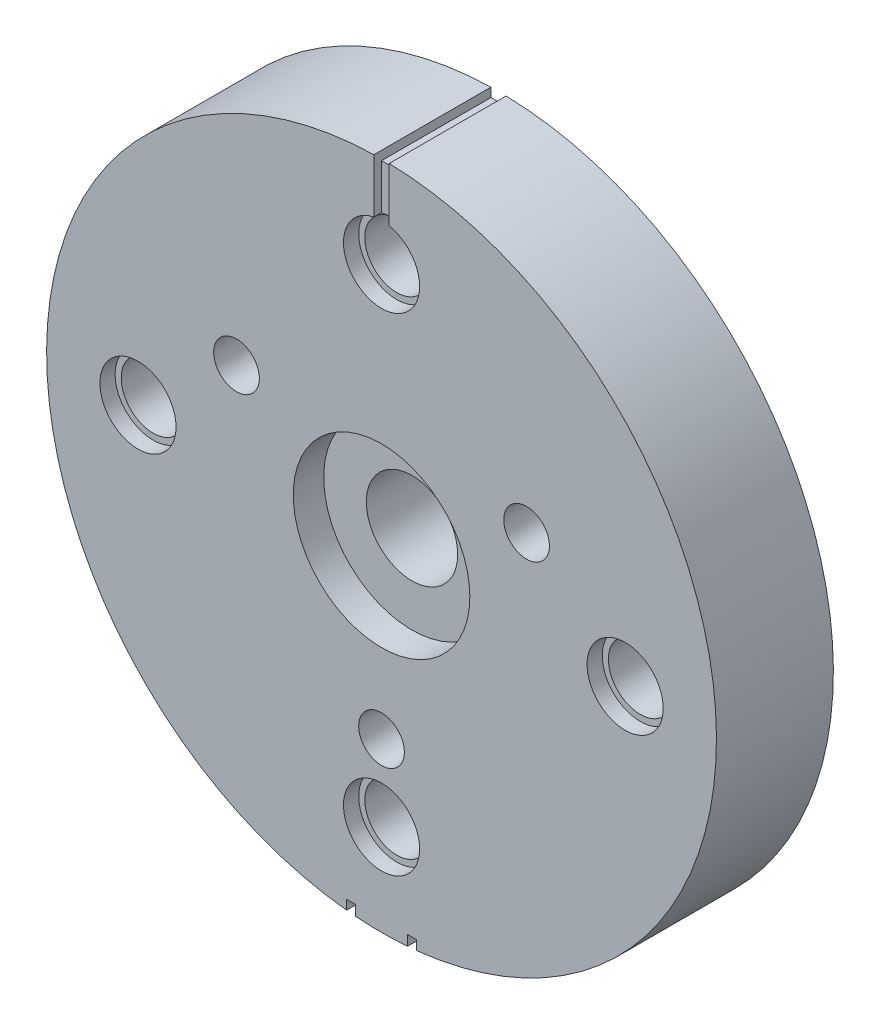
ISO-10303-21;
HEADER;
FILE_DESCRIPTION(('STEP AP214'),'2;1');
FILE_NAME('part.step','',(''),(''),'','','');
FILE_SCHEMA(('AUTOMOTIVE_DESIGN { 1 0 10303 214 1 1 1 1 }'));
ENDSEC;
DATA;
#1=APPLICATION_CONTEXT('core data for automotive mechanical design processes');
#2=APPLICATION_PROTOCOL_DEFINITION('international standard','automotive_design',2000,#1);
#3=PRODUCT_CONTEXT('',#1,'mechanical');
#4=PRODUCT('Part','Part','',(#3));
#5=PRODUCT_RELATED_PRODUCT_CATEGORY('part','',(#4));
#6=PRODUCT_DEFINITION_FORMATION('','',#4);
#7=PRODUCT_DEFINITION_CONTEXT('part definition',#1,'design');
#8=PRODUCT_DEFINITION('design','',#6,#7);
#9=PRODUCT_DEFINITION_SHAPE('','',#8);
#10=(LENGTH_UNIT() NAMED_UNIT(*) SI_UNIT(.MILLI.,.METRE.));
#11=(NAMED_UNIT(*) PLANE_ANGLE_UNIT() SI_UNIT($,.RADIAN.));
#12=(NAMED_UNIT(*) SI_UNIT($,.STERADIAN.) SOLID_ANGLE_UNIT());
#13=UNCERTAINTY_MEASURE_WITH_UNIT(LENGTH_MEASURE(1.E-05),#10,'distance_accuracy_value','');
#14=(GEOMETRIC_REPRESENTATION_CONTEXT(3) GLOBAL_UNCERTAINTY_ASSIGNED_CONTEXT((#13)) GLOBAL_UNIT_ASSIGNED_CONTEXT((#10,
#11,#12)) REPRESENTATION_CONTEXT('',''));
#15=CARTESIAN_POINT('',(0.,0.,0.));
#16=DIRECTION('',(0.,0.,1.));
#17=DIRECTION('',(1.,0.,0.));
#18=AXIS2_PLACEMENT_3D('',#15,#16,#17);
#19=CARTESIAN_POINT('',(-0.25,10.7016404297244,-3.84));
#20=DIRECTION('',(0.,-1.,0.));
#21=DIRECTION('',(0.,0.,-1.));
#22=AXIS2_PLACEMENT_3D('',#19,#20,#21);
#23=PLANE('',#22);
#24=DIRECTION('',(-1.,0.,0.));
#25=VECTOR('',#24,1.);
#26=CARTESIAN_POINT('',(-0.25,10.7016404297244,-0.25));
#27=LINE('',#26,#25);
#28=CARTESIAN_POINT('',(0.25,10.7016404297244,-0.25));
#29=VERTEX_POINT('',#28);
#30=CARTESIAN_POINT('',(-0.25,10.7016404297244,-0.25));
#31=VERTEX_POINT('',#30);
#32=EDGE_CURVE('E142',#29,#31,#27,.T.);
#33=ORIENTED_EDGE('',*,*,#32,.F.);
#34=DIRECTION('',(0.,0.,1.));
#35=VECTOR('',#34,1.);
#36=CARTESIAN_POINT('',(0.25,10.7016404297244,-3.84));
#37=LINE('',#36,#35);
#38=CARTESIAN_POINT('',(0.25,10.7016404297244,-3.84));
#39=VERTEX_POINT('',#38);
#40=EDGE_CURVE('E151',#39,#29,#37,.T.);
#41=ORIENTED_EDGE('',*,*,#40,.F.);
#42=DIRECTION('',(1.,0.,0.));
#43=VECTOR('',#42,1.);
#44=CARTESIAN_POINT('',(-0.25,10.7016404297244,-3.84));
#45=LINE('',#44,#43);
#46=CARTESIAN_POINT('',(-0.25,10.7016404297244,-3.84));
#47=VERTEX_POINT('',#46);
#48=EDGE_CURVE('E149',#47,#39,#45,.T.);
#49=ORIENTED_EDGE('',*,*,#48,.F.);
#50=DIRECTION('',(0.,0.,1.));
#51=VECTOR('',#50,1.);
#52=CARTESIAN_POINT('',(-0.25,10.7016404297244,-3.84));
#53=LINE('',#52,#51);
#54=EDGE_CURVE('E136',#47,#31,#53,.T.);
#55=ORIENTED_EDGE('',*,*,#54,.T.);
#56=EDGE_LOOP('',(#33,#41,#49,#55));
#57=FACE_BOUND('',#56,.T.);
#58=ADVANCED_FACE('F32',(#57),#23,.F.);
#59=CARTESIAN_POINT('',(0.,0.,-3.84));
#60=DIRECTION('',(0.,0.,1.));
#61=DIRECTION('',(1.,0.,0.));
#62=AXIS2_PLACEMENT_3D('',#59,#60,#61);
#63=CYLINDRICAL_SURFACE('',#62,11.);
#64=DIRECTION('',(0.,0.,1.));
#65=VECTOR('',#64,1.);
#66=CARTESIAN_POINT('',(-0.25,10.9971587239614,-3.84));
#67=LINE('',#66,#65);
#68=CARTESIAN_POINT('',(-0.25,10.9971587239614,-3.84));
#69=VERTEX_POINT('',#68);
#70=CARTESIAN_POINT('',(-0.25,10.9971587239614,0.));
#71=VERTEX_POINT('',#70);
#72=EDGE_CURVE('E161',#69,#71,#67,.T.);
#73=ORIENTED_EDGE('',*,*,#72,.F.);
#74=CARTESIAN_POINT('',(0.,0.,-3.84));
#75=DIRECTION('',(0.,0.,1.));
#76=DIRECTION('',(1.,0.,0.));
#77=AXIS2_PLACEMENT_3D('',#74,#75,#76);
#78=CIRCLE('',#77,11.);
#79=CARTESIAN_POINT('',(-1.14687334264794,-10.9400494302322,-3.84));
#80=VERTEX_POINT('',#79);
#81=EDGE_CURVE('E292',#69,#80,#78,.T.);
#82=ORIENTED_EDGE('',*,*,#81,.T.);
#83=DIRECTION('',(0.,0.,1.));
#84=VECTOR('',#83,1.);
#85=CARTESIAN_POINT('',(-1.14687334264794,-10.9400494302322,-3.84));
#86=LINE('',#85,#84);
#87=CARTESIAN_POINT('',(-1.14687334264794,-10.9400494302322,0.));
#88=VERTEX_POINT('',#87);
#89=EDGE_CURVE('E205',#88,#80,#86,.F.);
#90=ORIENTED_EDGE('',*,*,#89,.F.);
#91=CARTESIAN_POINT('',(0.,0.,0.));
#92=DIRECTION('',(0.,0.,1.));
#93=DIRECTION('',(1.,0.,0.));
#94=AXIS2_PLACEMENT_3D('',#91,#92,#93);
#95=CIRCLE('',#94,11.);
#96=EDGE_CURVE('E286',#71,#88,#95,.T.);
#97=ORIENTED_EDGE('',*,*,#96,.F.);
#98=EDGE_LOOP('',(#73,#82,#90,#97));
#99=FACE_BOUND('',#98,.T.);
#100=ADVANCED_FACE('F334',(#99),#63,.T.);
#101=DIRECTION('',(0.,0.,1.));
#102=VECTOR('',#101,1.);
#103=CARTESIAN_POINT('',(0.25,10.9971587239614,-3.84));
#104=LINE('',#103,#102);
#105=CARTESIAN_POINT('',(0.25,10.9971587239614,0.));
#106=VERTEX_POINT('',#105);
#107=CARTESIAN_POINT('',(0.25,10.9971587239614,-3.84));
#108=VERTEX_POINT('',#107);
#109=EDGE_CURVE('E154',#106,#108,#104,.F.);
#110=ORIENTED_EDGE('',*,*,#109,.F.);
#111=CARTESIAN_POINT('',(1.15414337232538,-10.9392848521335,0.));
#112=VERTEX_POINT('',#111);
#113=EDGE_CURVE('E296',#112,#106,#95,.T.);
#114=ORIENTED_EDGE('',*,*,#113,.F.);
#115=DIRECTION('',(0.,0.,1.));
#116=VECTOR('',#115,1.);
#117=CARTESIAN_POINT('',(1.15414337232538,-10.9392848521335,-3.84));
#118=LINE('',#117,#116);
#119=CARTESIAN_POINT('',(1.15414337232538,-10.9392848521335,-3.84));
#120=VERTEX_POINT('',#119);
#121=EDGE_CURVE('E181',#120,#112,#118,.T.);
#122=ORIENTED_EDGE('',*,*,#121,.F.);
#123=EDGE_CURVE('E291',#120,#108,#78,.T.);
#124=ORIENTED_EDGE('',*,*,#123,.T.);
#125=EDGE_LOOP('',(#110,#114,#122,#124));
#126=FACE_BOUND('',#125,.T.);
#127=ADVANCED_FACE('F323',(#126),#63,.T.);
#128=CARTESIAN_POINT('',(0.,0.,-3.84));
#129=DIRECTION('',(0.,0.,1.));
#130=DIRECTION('',(1.,0.,0.));
#131=AXIS2_PLACEMENT_3D('',#128,#129,#130);
#132=CYLINDRICAL_SURFACE('',#131,1.5);
#133=CARTESIAN_POINT('',(0.,0.,-3.84));
#134=DIRECTION('',(0.,0.,1.));
#135=DIRECTION('',(1.,0.,0.));
#136=AXIS2_PLACEMENT_3D('',#133,#134,#135);
#137=CIRCLE('',#136,1.5);
#138=CARTESIAN_POINT('',(1.5,0.,-3.84));
#139=VERTEX_POINT('',#138);
#140=EDGE_CURVE('E281',#139,#139,#137,.T.);
#141=ORIENTED_EDGE('',*,*,#140,.F.);
#142=EDGE_LOOP('',(#141));
#143=FACE_BOUND('',#142,.T.);
#144=CARTESIAN_POINT('',(0.,0.,-1.));
#145=DIRECTION('',(0.,0.,1.));
#146=DIRECTION('',(1.,0.,0.));
#147=AXIS2_PLACEMENT_3D('',#144,#145,#146);
#148=CIRCLE('',#147,1.5);
#149=CARTESIAN_POINT('',(1.5,0.,-1.));
#150=VERTEX_POINT('',#149);
#151=EDGE_CURVE('E272',#150,#150,#148,.T.);
#152=ORIENTED_EDGE('',*,*,#151,.T.);
#153=EDGE_LOOP('',(#152));
#154=FACE_BOUND('',#153,.T.);
#155=ADVANCED_FACE('F442',(#143,#154),#132,.F.);
#156=DIRECTION('',(0.,0.,1.));
#157=VECTOR('',#156,1.);
#158=CARTESIAN_POINT('',(0.853471957951407,-10.9668402749831,-3.84));
#159=LINE('',#158,#157);
#160=CARTESIAN_POINT('',(0.853471957951407,-10.9668402749831,0.));
#161=VERTEX_POINT('',#160);
#162=CARTESIAN_POINT('',(0.853471957951407,-10.9668402749831,-3.84));
#163=VERTEX_POINT('',#162);
#164=EDGE_CURVE('E178',#161,#163,#159,.F.);
#165=ORIENTED_EDGE('',*,*,#164,.F.);
#166=CARTESIAN_POINT('',(-0.847286826870816,-10.9673198655374,0.));
#167=VERTEX_POINT('',#166);
#168=EDGE_CURVE('E293',#167,#161,#95,.T.);
#169=ORIENTED_EDGE('',*,*,#168,.F.);
#170=DIRECTION('',(0.,0.,1.));
#171=VECTOR('',#170,1.);
#172=CARTESIAN_POINT('',(-0.847286826870816,-10.9673198655374,-3.84));
#173=LINE('',#172,#171);
#174=CARTESIAN_POINT('',(-0.847286826870816,-10.9673198655374,-3.84));
#175=VERTEX_POINT('',#174);
#176=EDGE_CURVE('E201',#175,#167,#173,.T.);
#177=ORIENTED_EDGE('',*,*,#176,.F.);
#178=EDGE_CURVE('E287',#175,#163,#78,.T.);
#179=ORIENTED_EDGE('',*,*,#178,.T.);
#180=EDGE_LOOP('',(#165,#169,#177,#179));
#181=FACE_BOUND('',#180,.T.);
#182=ADVANCED_FACE('F34',(#181),#63,.T.);
#183=CARTESIAN_POINT('',(0.,0.,-3.84));
#184=DIRECTION('',(0.,0.,1.));
#185=DIRECTION('',(1.,0.,0.));
#186=AXIS2_PLACEMENT_3D('',#183,#184,#185);
#187=PLANE('',#186);
#188=ORIENTED_EDGE('',*,*,#81,.F.);
#189=DIRECTION('',(0.,-1.,0.));
#190=VECTOR('',#189,1.);
#191=CARTESIAN_POINT('',(-0.25,10.999999392751,-3.84));
#192=LINE('',#191,#190);
#193=EDGE_CURVE('E335',#69,#47,#192,.T.);
#194=ORIENTED_EDGE('',*,*,#193,.T.);
#195=ORIENTED_EDGE('',*,*,#48,.T.);
#196=DIRECTION('',(0.,1.,0.));
#197=VECTOR('',#196,1.);
#198=CARTESIAN_POINT('',(0.25,10.999999392751,-3.84));
#199=LINE('',#198,#197);
#200=EDGE_CURVE('E152',#39,#108,#199,.T.);
#201=ORIENTED_EDGE('',*,*,#200,.T.);
#202=ORIENTED_EDGE('',*,*,#123,.F.);
#203=DIRECTION('',(0.,1.,0.));
#204=VECTOR('',#203,1.);
#205=CARTESIAN_POINT('',(1.15414337232538,-10.6296529722168,-3.84));
#206=LINE('',#205,#204);
#207=CARTESIAN_POINT('',(1.15414337232538,-10.6296529722168,-3.84));
#208=VERTEX_POINT('',#207);
#209=EDGE_CURVE('E164',#120,#208,#206,.T.);
#210=ORIENTED_EDGE('',*,*,#209,.T.);
#211=DIRECTION('',(-1.,0.,0.));
#212=VECTOR('',#211,1.);
#213=CARTESIAN_POINT('',(0.853471957951407,-10.6296529722168,-3.84));
#214=LINE('',#213,#212);
#215=CARTESIAN_POINT('',(0.853471957951407,-10.6296529722168,-3.84));
#216=VERTEX_POINT('',#215);
#217=EDGE_CURVE('E167',#208,#216,#214,.T.);
#218=ORIENTED_EDGE('',*,*,#217,.T.);
#219=DIRECTION('',(0.,-1.,0.));
#220=VECTOR('',#219,1.);
#221=CARTESIAN_POINT('',(0.853471957951407,-10.6296529722168,-3.84));
#222=LINE('',#221,#220);
#223=EDGE_CURVE('E171',#216,#163,#222,.T.);
#224=ORIENTED_EDGE('',*,*,#223,.T.);
#225=ORIENTED_EDGE('',*,*,#178,.F.);
#226=DIRECTION('',(0.,1.,0.));
#227=VECTOR('',#226,1.);
#228=CARTESIAN_POINT('',(-0.847286826870816,-10.6296529722168,-3.84));
#229=LINE('',#228,#227);
#230=CARTESIAN_POINT('',(-0.847286826870816,-10.6296529722168,-3.84));
#231=VERTEX_POINT('',#230);
#232=EDGE_CURVE('E184',#175,#231,#229,.T.);
#233=ORIENTED_EDGE('',*,*,#232,.T.);
#234=DIRECTION('',(-1.,0.,0.));
#235=VECTOR('',#234,1.);
#236=CARTESIAN_POINT('',(-1.14687334264794,-10.6296529722168,-3.84));
#237=LINE('',#236,#235);
#238=CARTESIAN_POINT('',(-1.14687334264794,-10.6296529722168,-3.84));
#239=VERTEX_POINT('',#238);
#240=EDGE_CURVE('E187',#231,#239,#237,.T.);
#241=ORIENTED_EDGE('',*,*,#240,.T.);
#242=DIRECTION('',(0.,-1.,0.));
#243=VECTOR('',#242,1.);
#244=CARTESIAN_POINT('',(-1.14687334264794,-10.6296529722168,-3.84));
#245=LINE('',#244,#243);
#246=EDGE_CURVE('E191',#239,#80,#245,.T.);
#247=ORIENTED_EDGE('',*,*,#246,.T.);
#248=EDGE_LOOP('',(#188,#194,#195,#201,#202,#210,#218,#224,#225,#233,#241,#247));
#249=FACE_BOUND('',#248,.T.);
#250=ORIENTED_EDGE('',*,*,#140,.T.);
#251=EDGE_LOOP('',(#250));
#252=FACE_BOUND('',#251,.T.);
#253=ADVANCED_FACE('F317',(#249,#252),#187,.F.);
#254=CARTESIAN_POINT('',(0.,0.,0.));
#255=DIRECTION('',(0.,0.,1.));
#256=DIRECTION('',(1.,0.,0.));
#257=AXIS2_PLACEMENT_3D('',#254,#255,#256);
#258=PLANE('',#257);
#259=CARTESIAN_POINT('',(0.,8.,0.));
#260=DIRECTION('',(0.,0.,1.));
#261=DIRECTION('',(1.,0.,0.));
#262=AXIS2_PLACEMENT_3D('',#259,#260,#261);
#263=CIRCLE('',#262,1.25);
#264=CARTESIAN_POINT('',(-0.25,9.22474487139159,0.));
#265=VERTEX_POINT('',#264);
#266=CARTESIAN_POINT('',(0.25,9.22474487139159,0.));
#267=VERTEX_POINT('',#266);
#268=EDGE_CURVE('E211',#265,#267,#263,.T.);
#269=ORIENTED_EDGE('',*,*,#268,.F.);
#270=DIRECTION('',(0.,-1.,0.));
#271=VECTOR('',#270,1.);
#272=CARTESIAN_POINT('',(-0.25,0.,0.));
#273=LINE('',#272,#271);
#274=EDGE_CURVE('E11',#71,#265,#273,.T.);
#275=ORIENTED_EDGE('',*,*,#274,.F.);
#276=ORIENTED_EDGE('',*,*,#96,.T.);
#277=DIRECTION('',(0.,-1.,0.));
#278=VECTOR('',#277,1.);
#279=CARTESIAN_POINT('',(-1.14687334264794,-10.6296529722168,0.));
#280=LINE('',#279,#278);
#281=CARTESIAN_POINT('',(-1.14687334264794,-10.6296529722168,0.));
#282=VERTEX_POINT('',#281);
#283=EDGE_CURVE('E188',#282,#88,#280,.T.);
#284=ORIENTED_EDGE('',*,*,#283,.F.);
#285=DIRECTION('',(-1.,0.,0.));
#286=VECTOR('',#285,1.);
#287=CARTESIAN_POINT('',(-1.14687334264794,-10.6296529722168,0.));
#288=LINE('',#287,#286);
#289=CARTESIAN_POINT('',(-0.847286826870816,-10.6296529722168,0.));
#290=VERTEX_POINT('',#289);
#291=EDGE_CURVE('E183',#290,#282,#288,.T.);
#292=ORIENTED_EDGE('',*,*,#291,.F.);
#293=DIRECTION('',(0.,1.,0.));
#294=VECTOR('',#293,1.);
#295=CARTESIAN_POINT('',(-0.847286826870816,0.,0.));
#296=LINE('',#295,#294);
#297=EDGE_CURVE('E290',#167,#290,#296,.T.);
#298=ORIENTED_EDGE('',*,*,#297,.F.);
#299=ORIENTED_EDGE('',*,*,#168,.T.);
#300=DIRECTION('',(0.,-1.,0.));
#301=VECTOR('',#300,1.);
#302=CARTESIAN_POINT('',(0.853471957951407,-10.6296529722168,0.));
#303=LINE('',#302,#301);
#304=CARTESIAN_POINT('',(0.853471957951407,-10.6296529722168,0.));
#305=VERTEX_POINT('',#304);
#306=EDGE_CURVE('E168',#305,#161,#303,.T.);
#307=ORIENTED_EDGE('',*,*,#306,.F.);
#308=DIRECTION('',(-1.,0.,0.));
#309=VECTOR('',#308,1.);
#310=CARTESIAN_POINT('',(0.853471957951407,-10.6296529722168,0.));
#311=LINE('',#310,#309);
#312=CARTESIAN_POINT('',(1.15414337232538,-10.6296529722168,0.));
#313=VERTEX_POINT('',#312);
#314=EDGE_CURVE('E163',#313,#305,#311,.T.);
#315=ORIENTED_EDGE('',*,*,#314,.F.);
#316=DIRECTION('',(0.,1.,0.));
#317=VECTOR('',#316,1.);
#318=CARTESIAN_POINT('',(1.15414337232538,0.,0.));
#319=LINE('',#318,#317);
#320=EDGE_CURVE('E40',#112,#313,#319,.T.);
#321=ORIENTED_EDGE('',*,*,#320,.F.);
#322=ORIENTED_EDGE('',*,*,#113,.T.);
#323=DIRECTION('',(0.,1.,0.));
#324=VECTOR('',#323,1.);
#325=CARTESIAN_POINT('',(0.25,10.999999392751,0.));
#326=LINE('',#325,#324);
#327=EDGE_CURVE('E722',#267,#106,#326,.T.);
#328=ORIENTED_EDGE('',*,*,#327,.F.);
#329=EDGE_LOOP('',(#269,#275,#276,#284,#292,#298,#299,#307,#315,#321,#322,#328));
#330=FACE_BOUND('',#329,.T.);
#331=CARTESIAN_POINT('',(8.,0.,0.));
#332=DIRECTION('',(0.,0.,1.));
#333=DIRECTION('',(1.,0.,0.));
#334=AXIS2_PLACEMENT_3D('',#331,#332,#333);
#335=CIRCLE('',#334,1.25);
#336=CARTESIAN_POINT('',(9.25,0.,0.));
#337=VERTEX_POINT('',#336);
#338=EDGE_CURVE('E220',#337,#337,#335,.T.);
#339=ORIENTED_EDGE('',*,*,#338,.F.);
#340=EDGE_LOOP('',(#339));
#341=FACE_BOUND('',#340,.T.);
#342=CARTESIAN_POINT('',(0.,-8.,0.));
#343=DIRECTION('',(0.,0.,1.));
#344=DIRECTION('',(1.,0.,0.));
#345=AXIS2_PLACEMENT_3D('',#342,#343,#344);
#346=CIRCLE('',#345,1.25);
#347=CARTESIAN_POINT('',(1.25,-8.,0.));
#348=VERTEX_POINT('',#347);
#349=EDGE_CURVE('E229',#348,#348,#346,.T.);
#350=ORIENTED_EDGE('',*,*,#349,.F.);
#351=EDGE_LOOP('',(#350));
#352=FACE_BOUND('',#351,.T.);
#353=CARTESIAN_POINT('',(-8.,0.,0.));
#354=DIRECTION('',(0.,0.,1.));
#355=DIRECTION('',(1.,0.,0.));
#356=AXIS2_PLACEMENT_3D('',#353,#354,#355);
#357=CIRCLE('',#356,1.25);
#358=CARTESIAN_POINT('',(-6.75,0.,0.));
#359=VERTEX_POINT('',#358);
#360=EDGE_CURVE('E238',#359,#359,#357,.T.);
#361=ORIENTED_EDGE('',*,*,#360,.F.);
#362=EDGE_LOOP('',(#361));
#363=FACE_BOUND('',#362,.T.);
#364=CARTESIAN_POINT('',(0.,-5.5,0.));
#365=DIRECTION('',(0.,0.,1.));
#366=DIRECTION('',(1.,0.,0.));
#367=AXIS2_PLACEMENT_3D('',#364,#365,#366);
#368=CIRCLE('',#367,0.75);
#369=CARTESIAN_POINT('',(0.75,-5.5,0.));
#370=VERTEX_POINT('',#369);
#371=EDGE_CURVE('E256',#370,#370,#368,.T.);
#372=ORIENTED_EDGE('',*,*,#371,.F.);
#373=EDGE_LOOP('',(#372));
#374=FACE_BOUND('',#373,.T.);
#375=CARTESIAN_POINT('',(4.763139720814,2.75,0.));
#376=DIRECTION('',(0.,0.,1.));
#377=DIRECTION('',(1.,0.,0.));
#378=AXIS2_PLACEMENT_3D('',#375,#376,#377);
#379=CIRCLE('',#378,0.75);
#380=CARTESIAN_POINT('',(5.513139720814,2.75,0.));
#381=VERTEX_POINT('',#380);
#382=EDGE_CURVE('E260',#381,#381,#379,.T.);
#383=ORIENTED_EDGE('',*,*,#382,.F.);
#384=EDGE_LOOP('',(#383));
#385=FACE_BOUND('',#384,.T.);
#386=CARTESIAN_POINT('',(-4.763139720814,2.75,0.));
#387=DIRECTION('',(0.,0.,1.));
#388=DIRECTION('',(1.,0.,0.));
#389=AXIS2_PLACEMENT_3D('',#386,#387,#388);
#390=CIRCLE('',#389,0.75);
#391=CARTESIAN_POINT('',(-4.013139720814,2.75,0.));
#392=VERTEX_POINT('',#391);
#393=EDGE_CURVE('E266',#392,#392,#390,.T.);
#394=ORIENTED_EDGE('',*,*,#393,.F.);
#395=EDGE_LOOP('',(#394));
#396=FACE_BOUND('',#395,.T.);
#397=CARTESIAN_POINT('',(0.,0.,0.));
#398=DIRECTION('',(0.,0.,1.));
#399=DIRECTION('',(1.,0.,0.));
#400=AXIS2_PLACEMENT_3D('',#397,#398,#399);
#401=CIRCLE('',#400,2.9);
#402=CARTESIAN_POINT('',(2.9,0.,0.));
#403=VERTEX_POINT('',#402);
#404=EDGE_CURVE('E277',#403,#403,#401,.T.);
#405=ORIENTED_EDGE('',*,*,#404,.F.);
#406=EDGE_LOOP('',(#405));
#407=FACE_BOUND('',#406,.T.);
#408=ADVANCED_FACE('F307',(#330,#341,#352,#363,#374,#385,#396,#407),#258,.T.);
#409=CARTESIAN_POINT('',(0.,0.,-1.));
#410=DIRECTION('',(0.,0.,1.));
#411=DIRECTION('',(1.,0.,0.));
#412=AXIS2_PLACEMENT_3D('',#409,#410,#411);
#413=CYLINDRICAL_SURFACE('',#412,2.9);
#414=CARTESIAN_POINT('',(0.,0.,-1.));
#415=DIRECTION('',(0.,0.,1.));
#416=DIRECTION('',(1.,0.,0.));
#417=AXIS2_PLACEMENT_3D('',#414,#415,#416);
#418=CIRCLE('',#417,2.9);
#419=CARTESIAN_POINT('',(2.9,0.,-1.));
#420=VERTEX_POINT('',#419);
#421=EDGE_CURVE('E278',#420,#420,#418,.T.);
#422=ORIENTED_EDGE('',*,*,#421,.F.);
#423=EDGE_LOOP('',(#422));
#424=FACE_BOUND('',#423,.T.);
#425=ORIENTED_EDGE('',*,*,#404,.T.);
#426=EDGE_LOOP('',(#425));
#427=FACE_BOUND('',#426,.T.);
#428=ADVANCED_FACE('F437',(#424,#427),#413,.F.);
#429=CARTESIAN_POINT('',(0.,0.,-1.));
#430=DIRECTION('',(0.,0.,1.));
#431=DIRECTION('',(1.,0.,0.));
#432=AXIS2_PLACEMENT_3D('',#429,#430,#431);
#433=PLANE('',#432);
#434=ORIENTED_EDGE('',*,*,#151,.F.);
#435=EDGE_LOOP('',(#434));
#436=FACE_BOUND('',#435,.T.);
#437=ORIENTED_EDGE('',*,*,#421,.T.);
#438=EDGE_LOOP('',(#437));
#439=FACE_BOUND('',#438,.T.);
#440=ADVANCED_FACE('F433',(#436,#439),#433,.T.);
#441=CARTESIAN_POINT('',(-4.763139720814,2.75,-2.));
#442=DIRECTION('',(0.,0.,1.));
#443=DIRECTION('',(1.,0.,0.));
#444=AXIS2_PLACEMENT_3D('',#441,#442,#443);
#445=CYLINDRICAL_SURFACE('',#444,0.75);
#446=CARTESIAN_POINT('',(-4.763139720814,2.75,-2.));
#447=DIRECTION('',(0.,0.,1.));
#448=DIRECTION('',(1.,0.,0.));
#449=AXIS2_PLACEMENT_3D('',#446,#447,#448);
#450=CIRCLE('',#449,0.75);
#451=CARTESIAN_POINT('',(-4.013139720814,2.75,-2.));
#452=VERTEX_POINT('',#451);
#453=EDGE_CURVE('E269',#452,#452,#450,.T.);
#454=ORIENTED_EDGE('',*,*,#453,.F.);
#455=EDGE_LOOP('',(#454));
#456=FACE_BOUND('',#455,.T.);
#457=ORIENTED_EDGE('',*,*,#393,.T.);
#458=EDGE_LOOP('',(#457));
#459=FACE_BOUND('',#458,.T.);
#460=ADVANCED_FACE('F429',(#456,#459),#445,.F.);
#461=CARTESIAN_POINT('',(-4.763139720814,2.75,-2.));
#462=DIRECTION('',(0.,0.,1.));
#463=DIRECTION('',(1.,0.,0.));
#464=AXIS2_PLACEMENT_3D('',#461,#462,#463);
#465=PLANE('',#464);
#466=ORIENTED_EDGE('',*,*,#453,.T.);
#467=EDGE_LOOP('',(#466));
#468=FACE_BOUND('',#467,.T.);
#469=ADVANCED_FACE('F425',(#468),#465,.T.);
#470=CARTESIAN_POINT('',(4.763139720814,2.75,-2.));
#471=DIRECTION('',(0.,0.,1.));
#472=DIRECTION('',(1.,0.,0.));
#473=AXIS2_PLACEMENT_3D('',#470,#471,#472);
#474=CYLINDRICAL_SURFACE('',#473,0.75);
#475=CARTESIAN_POINT('',(4.763139720814,2.75,-2.));
#476=DIRECTION('',(0.,0.,1.));
#477=DIRECTION('',(1.,0.,0.));
#478=AXIS2_PLACEMENT_3D('',#475,#476,#477);
#479=CIRCLE('',#478,0.75);
#480=CARTESIAN_POINT('',(5.513139720814,2.75,-2.));
#481=VERTEX_POINT('',#480);
#482=EDGE_CURVE('E263',#481,#481,#479,.T.);
#483=ORIENTED_EDGE('',*,*,#482,.F.);
#484=EDGE_LOOP('',(#483));
#485=FACE_BOUND('',#484,.T.);
#486=ORIENTED_EDGE('',*,*,#382,.T.);
#487=EDGE_LOOP('',(#486));
#488=FACE_BOUND('',#487,.T.);
#489=ADVANCED_FACE('F421',(#485,#488),#474,.F.);
#490=CARTESIAN_POINT('',(4.763139720814,2.75,-2.));
#491=DIRECTION('',(0.,0.,1.));
#492=DIRECTION('',(1.,0.,0.));
#493=AXIS2_PLACEMENT_3D('',#490,#491,#492);
#494=PLANE('',#493);
#495=ORIENTED_EDGE('',*,*,#482,.T.);
#496=EDGE_LOOP('',(#495));
#497=FACE_BOUND('',#496,.T.);
#498=ADVANCED_FACE('F417',(#497),#494,.T.);
#499=CARTESIAN_POINT('',(0.,-5.5,-2.));
#500=DIRECTION('',(0.,0.,1.));
#501=DIRECTION('',(1.,0.,0.));
#502=AXIS2_PLACEMENT_3D('',#499,#500,#501);
#503=CYLINDRICAL_SURFACE('',#502,0.75);
#504=CARTESIAN_POINT('',(0.,-5.5,-2.));
#505=DIRECTION('',(0.,0.,1.));
#506=DIRECTION('',(1.,0.,0.));
#507=AXIS2_PLACEMENT_3D('',#504,#505,#506);
#508=CIRCLE('',#507,0.75);
#509=CARTESIAN_POINT('',(0.75,-5.5,-2.));
#510=VERTEX_POINT('',#509);
#511=EDGE_CURVE('E257',#510,#510,#508,.T.);
#512=ORIENTED_EDGE('',*,*,#511,.F.);
#513=EDGE_LOOP('',(#512));
#514=FACE_BOUND('',#513,.T.);
#515=ORIENTED_EDGE('',*,*,#371,.T.);
#516=EDGE_LOOP('',(#515));
#517=FACE_BOUND('',#516,.T.);
#518=ADVANCED_FACE('F413',(#514,#517),#503,.F.);
#519=CARTESIAN_POINT('',(0.,-5.5,-2.));
#520=DIRECTION('',(0.,0.,1.));
#521=DIRECTION('',(1.,0.,0.));
#522=AXIS2_PLACEMENT_3D('',#519,#520,#521);
#523=PLANE('',#522);
#524=ORIENTED_EDGE('',*,*,#511,.T.);
#525=EDGE_LOOP('',(#524));
#526=FACE_BOUND('',#525,.T.);
#527=ADVANCED_FACE('F409',(#526),#523,.T.);
#528=CARTESIAN_POINT('',(-8.,0.,-0.5));
#529=DIRECTION('',(0.,0.,1.));
#530=DIRECTION('',(1.,0.,0.));
#531=AXIS2_PLACEMENT_3D('',#528,#529,#530);
#532=CYLINDRICAL_SURFACE('',#531,1.25);
#533=CARTESIAN_POINT('',(-8.,0.,-0.5));
#534=DIRECTION('',(0.,0.,1.));
#535=DIRECTION('',(1.,0.,0.));
#536=AXIS2_PLACEMENT_3D('',#533,#534,#535);
#537=CIRCLE('',#536,1.25);
#538=CARTESIAN_POINT('',(-6.75,0.,-0.5));
#539=VERTEX_POINT('',#538);
#540=EDGE_CURVE('E239',#539,#539,#537,.T.);
#541=ORIENTED_EDGE('',*,*,#540,.F.);
#542=EDGE_LOOP('',(#541));
#543=FACE_BOUND('',#542,.T.);
#544=ORIENTED_EDGE('',*,*,#360,.T.);
#545=EDGE_LOOP('',(#544));
#546=FACE_BOUND('',#545,.T.);
#547=ADVANCED_FACE('F412',(#543,#546),#532,.F.);
#548=CARTESIAN_POINT('',(-8.,0.,-0.5));
#549=DIRECTION('',(0.,0.,1.));
#550=DIRECTION('',(1.,0.,0.));
#551=AXIS2_PLACEMENT_3D('',#548,#549,#550);
#552=PLANE('',#551);
#553=CARTESIAN_POINT('',(-8.,0.,-0.5));
#554=DIRECTION('',(0.,0.,1.));
#555=DIRECTION('',(1.,0.,0.));
#556=AXIS2_PLACEMENT_3D('',#553,#554,#555);
#557=CIRCLE('',#556,1.05);
#558=CARTESIAN_POINT('',(-6.95,0.,-0.5));
#559=VERTEX_POINT('',#558);
#560=EDGE_CURVE('E233',#559,#559,#557,.T.);
#561=ORIENTED_EDGE('',*,*,#560,.F.);
#562=EDGE_LOOP('',(#561));
#563=FACE_BOUND('',#562,.T.);
#564=ORIENTED_EDGE('',*,*,#540,.T.);
#565=EDGE_LOOP('',(#564));
#566=FACE_BOUND('',#565,.T.);
#567=ADVANCED_FACE('F494',(#563,#566),#552,.T.);
#568=CARTESIAN_POINT('',(-8.,0.,-3.));
#569=DIRECTION('',(0.,0.,1.));
#570=DIRECTION('',(1.,0.,0.));
#571=AXIS2_PLACEMENT_3D('',#568,#569,#570);
#572=PLANE('',#571);
#573=CARTESIAN_POINT('',(-8.,0.,-3.));
#574=DIRECTION('',(0.,0.,1.));
#575=DIRECTION('',(1.,0.,0.));
#576=AXIS2_PLACEMENT_3D('',#573,#574,#575);
#577=CIRCLE('',#576,1.05);
#578=CARTESIAN_POINT('',(-6.95,0.,-3.));
#579=VERTEX_POINT('',#578);
#580=EDGE_CURVE('E242',#579,#579,#577,.T.);
#581=ORIENTED_EDGE('',*,*,#580,.T.);
#582=EDGE_LOOP('',(#581));
#583=FACE_BOUND('',#582,.T.);
#584=ADVANCED_FACE('F386',(#583),#572,.T.);
#585=CARTESIAN_POINT('',(-8.,0.,-3.));
#586=DIRECTION('',(0.,0.,1.));
#587=DIRECTION('',(1.,0.,0.));
#588=AXIS2_PLACEMENT_3D('',#585,#586,#587);
#589=CYLINDRICAL_SURFACE('',#588,1.05);
#590=ORIENTED_EDGE('',*,*,#580,.F.);
#591=EDGE_LOOP('',(#590));
#592=FACE_BOUND('',#591,.T.);
#593=ORIENTED_EDGE('',*,*,#560,.T.);
#594=EDGE_LOOP('',(#593));
#595=FACE_BOUND('',#594,.T.);
#596=ADVANCED_FACE('F510',(#592,#595),#589,.F.);
#597=CARTESIAN_POINT('',(0.,-8.,-0.5));
#598=DIRECTION('',(0.,0.,1.));
#599=DIRECTION('',(1.,0.,0.));
#600=AXIS2_PLACEMENT_3D('',#597,#598,#599);
#601=CYLINDRICAL_SURFACE('',#600,1.25);
#602=CARTESIAN_POINT('',(0.,-8.,-0.5));
#603=DIRECTION('',(0.,0.,1.));
#604=DIRECTION('',(1.,0.,0.));
#605=AXIS2_PLACEMENT_3D('',#602,#603,#604);
#606=CIRCLE('',#605,1.25);
#607=CARTESIAN_POINT('',(1.25,-8.,-0.5));
#608=VERTEX_POINT('',#607);
#609=EDGE_CURVE('E230',#608,#608,#606,.T.);
#610=ORIENTED_EDGE('',*,*,#609,.F.);
#611=EDGE_LOOP('',(#610));
#612=FACE_BOUND('',#611,.T.);
#613=ORIENTED_EDGE('',*,*,#349,.T.);
#614=EDGE_LOOP('',(#613));
#615=FACE_BOUND('',#614,.T.);
#616=ADVANCED_FACE('F517',(#612,#615),#601,.F.);
#617=CARTESIAN_POINT('',(0.,-8.,-0.5));
#618=DIRECTION('',(0.,0.,1.));
#619=DIRECTION('',(1.,0.,0.));
#620=AXIS2_PLACEMENT_3D('',#617,#618,#619);
#621=PLANE('',#620);
#622=CARTESIAN_POINT('',(0.,-8.,-0.5));
#623=DIRECTION('',(0.,0.,1.));
#624=DIRECTION('',(1.,0.,0.));
#625=AXIS2_PLACEMENT_3D('',#622,#623,#624);
#626=CIRCLE('',#625,1.05);
#627=CARTESIAN_POINT('',(1.05,-8.,-0.5));
#628=VERTEX_POINT('',#627);
#629=EDGE_CURVE('E224',#628,#628,#626,.T.);
#630=ORIENTED_EDGE('',*,*,#629,.F.);
#631=EDGE_LOOP('',(#630));
#632=FACE_BOUND('',#631,.T.);
#633=ORIENTED_EDGE('',*,*,#609,.T.);
#634=EDGE_LOOP('',(#633));
#635=FACE_BOUND('',#634,.T.);
#636=ADVANCED_FACE('F403',(#632,#635),#621,.T.);
#637=CARTESIAN_POINT('',(0.,-8.,-3.));
#638=DIRECTION('',(0.,0.,1.));
#639=DIRECTION('',(1.,0.,0.));
#640=AXIS2_PLACEMENT_3D('',#637,#638,#639);
#641=PLANE('',#640);
#642=CARTESIAN_POINT('',(0.,-8.,-3.));
#643=DIRECTION('',(0.,0.,1.));
#644=DIRECTION('',(1.,0.,0.));
#645=AXIS2_PLACEMENT_3D('',#642,#643,#644);
#646=CIRCLE('',#645,1.05);
#647=CARTESIAN_POINT('',(1.05,-8.,-3.));
#648=VERTEX_POINT('',#647);
#649=EDGE_CURVE('E253',#648,#648,#646,.T.);
#650=ORIENTED_EDGE('',*,*,#649,.T.);
#651=EDGE_LOOP('',(#650));
#652=FACE_BOUND('',#651,.T.);
#653=ADVANCED_FACE('F399',(#652),#641,.T.);
#654=CARTESIAN_POINT('',(0.,-8.,-3.));
#655=DIRECTION('',(0.,0.,1.));
#656=DIRECTION('',(1.,0.,0.));
#657=AXIS2_PLACEMENT_3D('',#654,#655,#656);
#658=CYLINDRICAL_SURFACE('',#657,1.05);
#659=ORIENTED_EDGE('',*,*,#649,.F.);
#660=EDGE_LOOP('',(#659));
#661=FACE_BOUND('',#660,.T.);
#662=ORIENTED_EDGE('',*,*,#629,.T.);
#663=EDGE_LOOP('',(#662));
#664=FACE_BOUND('',#663,.T.);
#665=ADVANCED_FACE('F402',(#661,#664),#658,.F.);
#666=CARTESIAN_POINT('',(8.,0.,-0.5));
#667=DIRECTION('',(0.,0.,1.));
#668=DIRECTION('',(1.,0.,0.));
#669=AXIS2_PLACEMENT_3D('',#666,#667,#668);
#670=CYLINDRICAL_SURFACE('',#669,1.25);
#671=CARTESIAN_POINT('',(8.,0.,-0.5));
#672=DIRECTION('',(0.,0.,1.));
#673=DIRECTION('',(1.,0.,0.));
#674=AXIS2_PLACEMENT_3D('',#671,#672,#673);
#675=CIRCLE('',#674,1.25);
#676=CARTESIAN_POINT('',(9.25,0.,-0.5));
#677=VERTEX_POINT('',#676);
#678=EDGE_CURVE('E221',#677,#677,#675,.T.);
#679=ORIENTED_EDGE('',*,*,#678,.F.);
#680=EDGE_LOOP('',(#679));
#681=FACE_BOUND('',#680,.T.);
#682=ORIENTED_EDGE('',*,*,#338,.T.);
#683=EDGE_LOOP('',(#682));
#684=FACE_BOUND('',#683,.T.);
#685=ADVANCED_FACE('F407',(#681,#684),#670,.F.);
#686=CARTESIAN_POINT('',(8.,0.,-0.5));
#687=DIRECTION('',(0.,0.,1.));
#688=DIRECTION('',(1.,0.,0.));
#689=AXIS2_PLACEMENT_3D('',#686,#687,#688);
#690=PLANE('',#689);
#691=CARTESIAN_POINT('',(8.,0.,-0.5));
#692=DIRECTION('',(0.,0.,1.));
#693=DIRECTION('',(1.,0.,0.));
#694=AXIS2_PLACEMENT_3D('',#691,#692,#693);
#695=CIRCLE('',#694,1.05);
#696=CARTESIAN_POINT('',(9.05,0.,-0.5));
#697=VERTEX_POINT('',#696);
#698=EDGE_CURVE('E215',#697,#697,#695,.T.);
#699=ORIENTED_EDGE('',*,*,#698,.F.);
#700=EDGE_LOOP('',(#699));
#701=FACE_BOUND('',#700,.T.);
#702=ORIENTED_EDGE('',*,*,#678,.T.);
#703=EDGE_LOOP('',(#702));
#704=FACE_BOUND('',#703,.T.);
#705=ADVANCED_FACE('F397',(#701,#704),#690,.T.);
#706=CARTESIAN_POINT('',(8.,0.,-3.));
#707=DIRECTION('',(0.,0.,1.));
#708=DIRECTION('',(1.,0.,0.));
#709=AXIS2_PLACEMENT_3D('',#706,#707,#708);
#710=PLANE('',#709);
#711=CARTESIAN_POINT('',(8.,0.,-3.));
#712=DIRECTION('',(0.,0.,1.));
#713=DIRECTION('',(1.,0.,0.));
#714=AXIS2_PLACEMENT_3D('',#711,#712,#713);
#715=CIRCLE('',#714,1.05);
#716=CARTESIAN_POINT('',(9.05,0.,-3.));
#717=VERTEX_POINT('',#716);
#718=EDGE_CURVE('E250',#717,#717,#715,.T.);
#719=ORIENTED_EDGE('',*,*,#718,.T.);
#720=EDGE_LOOP('',(#719));
#721=FACE_BOUND('',#720,.T.);
#722=ADVANCED_FACE('F393',(#721),#710,.T.);
#723=CARTESIAN_POINT('',(8.,0.,-3.));
#724=DIRECTION('',(0.,0.,1.));
#725=DIRECTION('',(1.,0.,0.));
#726=AXIS2_PLACEMENT_3D('',#723,#724,#725);
#727=CYLINDRICAL_SURFACE('',#726,1.05);
#728=ORIENTED_EDGE('',*,*,#718,.F.);
#729=EDGE_LOOP('',(#728));
#730=FACE_BOUND('',#729,.T.);
#731=ORIENTED_EDGE('',*,*,#698,.T.);
#732=EDGE_LOOP('',(#731));
#733=FACE_BOUND('',#732,.T.);
#734=ADVANCED_FACE('F389',(#730,#733),#727,.F.);
#735=CARTESIAN_POINT('',(0.,8.,-0.5));
#736=DIRECTION('',(0.,0.,1.));
#737=DIRECTION('',(1.,0.,0.));
#738=AXIS2_PLACEMENT_3D('',#735,#736,#737);
#739=CYLINDRICAL_SURFACE('',#738,1.25);
#740=CARTESIAN_POINT('',(0.,8.,-0.5));
#741=DIRECTION('',(0.,0.,1.));
#742=DIRECTION('',(1.,0.,0.));
#743=AXIS2_PLACEMENT_3D('',#740,#741,#742);
#744=CIRCLE('',#743,1.25);
#745=CARTESIAN_POINT('',(1.25,8.,-0.5));
#746=VERTEX_POINT('',#745);
#747=EDGE_CURVE('E212',#746,#746,#744,.T.);
#748=ORIENTED_EDGE('',*,*,#747,.F.);
#749=EDGE_LOOP('',(#748));
#750=FACE_BOUND('',#749,.T.);
#751=CARTESIAN_POINT('',(0.,8.,-0.25));
#752=DIRECTION('',(0.,0.,1.));
#753=DIRECTION('',(1.,0.,0.));
#754=AXIS2_PLACEMENT_3D('',#751,#752,#753);
#755=CIRCLE('',#754,1.25);
#756=CARTESIAN_POINT('',(-0.25,9.22474487139159,-0.25));
#757=VERTEX_POINT('',#756);
#758=CARTESIAN_POINT('',(0.25,9.22474487139159,-0.25));
#759=VERTEX_POINT('',#758);
#760=EDGE_CURVE('E146',#757,#759,#755,.F.);
#761=ORIENTED_EDGE('',*,*,#760,.F.);
#762=DIRECTION('',(0.,0.,1.));
#763=VECTOR('',#762,1.);
#764=CARTESIAN_POINT('',(-0.25,9.22474487139159,-0.5));
#765=LINE('',#764,#763);
#766=EDGE_CURVE('E139',#757,#265,#765,.T.);
#767=ORIENTED_EDGE('',*,*,#766,.T.);
#768=ORIENTED_EDGE('',*,*,#268,.T.);
#769=DIRECTION('',(0.,0.,1.));
#770=VECTOR('',#769,1.);
#771=CARTESIAN_POINT('',(0.25,9.22474487139159,-0.5));
#772=LINE('',#771,#770);
#773=EDGE_CURVE('E726',#267,#759,#772,.F.);
#774=ORIENTED_EDGE('',*,*,#773,.T.);
#775=EDGE_LOOP('',(#761,#767,#768,#774));
#776=FACE_BOUND('',#775,.T.);
#777=ADVANCED_FACE('F392',(#750,#776),#739,.F.);
#778=CARTESIAN_POINT('',(0.,8.,-0.5));
#779=DIRECTION('',(0.,0.,1.));
#780=DIRECTION('',(1.,0.,0.));
#781=AXIS2_PLACEMENT_3D('',#778,#779,#780);
#782=PLANE('',#781);
#783=CARTESIAN_POINT('',(0.,8.,-0.5));
#784=DIRECTION('',(0.,0.,1.));
#785=DIRECTION('',(1.,0.,0.));
#786=AXIS2_PLACEMENT_3D('',#783,#784,#785);
#787=CIRCLE('',#786,1.05);
#788=CARTESIAN_POINT('',(1.05,8.,-0.5));
#789=VERTEX_POINT('',#788);
#790=EDGE_CURVE('E208',#789,#789,#787,.T.);
#791=ORIENTED_EDGE('',*,*,#790,.F.);
#792=EDGE_LOOP('',(#791));
#793=FACE_BOUND('',#792,.T.);
#794=ORIENTED_EDGE('',*,*,#747,.T.);
#795=EDGE_LOOP('',(#794));
#796=FACE_BOUND('',#795,.T.);
#797=ADVANCED_FACE('F380',(#793,#796),#782,.T.);
#798=CARTESIAN_POINT('',(0.,8.,-3.));
#799=DIRECTION('',(0.,0.,1.));
#800=DIRECTION('',(1.,0.,0.));
#801=AXIS2_PLACEMENT_3D('',#798,#799,#800);
#802=PLANE('',#801);
#803=CARTESIAN_POINT('',(0.,8.,-3.));
#804=DIRECTION('',(0.,0.,1.));
#805=DIRECTION('',(1.,0.,0.));
#806=AXIS2_PLACEMENT_3D('',#803,#804,#805);
#807=CIRCLE('',#806,1.05);
#808=CARTESIAN_POINT('',(1.05,8.,-3.));
#809=VERTEX_POINT('',#808);
#810=EDGE_CURVE('E247',#809,#809,#807,.T.);
#811=ORIENTED_EDGE('',*,*,#810,.T.);
#812=EDGE_LOOP('',(#811));
#813=FACE_BOUND('',#812,.T.);
#814=ADVANCED_FACE('F374',(#813),#802,.T.);
#815=CARTESIAN_POINT('',(0.,8.,-3.));
#816=DIRECTION('',(0.,0.,1.));
#817=DIRECTION('',(1.,0.,0.));
#818=AXIS2_PLACEMENT_3D('',#815,#816,#817);
#819=CYLINDRICAL_SURFACE('',#818,1.05);
#820=ORIENTED_EDGE('',*,*,#810,.F.);
#821=EDGE_LOOP('',(#820));
#822=FACE_BOUND('',#821,.T.);
#823=ORIENTED_EDGE('',*,*,#790,.T.);
#824=EDGE_LOOP('',(#823));
#825=FACE_BOUND('',#824,.T.);
#826=ADVANCED_FACE('F370',(#822,#825),#819,.F.);
#827=CARTESIAN_POINT('',(-1.14687334264794,-10.6296529722168,-3.84));
#828=DIRECTION('',(-1.,0.,0.));
#829=DIRECTION('',(0.,0.,1.));
#830=AXIS2_PLACEMENT_3D('',#827,#828,#829);
#831=PLANE('',#830);
#832=ORIENTED_EDGE('',*,*,#89,.T.);
#833=ORIENTED_EDGE('',*,*,#246,.F.);
#834=DIRECTION('',(0.,0.,1.));
#835=VECTOR('',#834,1.);
#836=CARTESIAN_POINT('',(-1.14687334264794,-10.6296529722168,-3.84));
#837=LINE('',#836,#835);
#838=EDGE_CURVE('E199',#239,#282,#837,.T.);
#839=ORIENTED_EDGE('',*,*,#838,.T.);
#840=ORIENTED_EDGE('',*,*,#283,.T.);
#841=EDGE_LOOP('',(#832,#833,#839,#840));
#842=FACE_BOUND('',#841,.T.);
#843=ADVANCED_FACE('F332',(#842),#831,.F.);
#844=CARTESIAN_POINT('',(-1.14687334264794,-10.6296529722168,-3.84));
#845=DIRECTION('',(0.,1.,0.));
#846=DIRECTION('',(0.,0.,1.));
#847=AXIS2_PLACEMENT_3D('',#844,#845,#846);
#848=PLANE('',#847);
#849=ORIENTED_EDGE('',*,*,#291,.T.);
#850=ORIENTED_EDGE('',*,*,#838,.F.);
#851=ORIENTED_EDGE('',*,*,#240,.F.);
#852=DIRECTION('',(0.,0.,1.));
#853=VECTOR('',#852,1.);
#854=CARTESIAN_POINT('',(-0.847286826870816,-10.6296529722168,-3.84));
#855=LINE('',#854,#853);
#856=EDGE_CURVE('E194',#231,#290,#855,.T.);
#857=ORIENTED_EDGE('',*,*,#856,.T.);
#858=EDGE_LOOP('',(#849,#850,#851,#857));
#859=FACE_BOUND('',#858,.T.);
#860=ADVANCED_FACE('F338',(#859),#848,.F.);
#861=CARTESIAN_POINT('',(-0.847286826870816,-10.6296529722168,-3.84));
#862=DIRECTION('',(1.,0.,0.));
#863=DIRECTION('',(0.,0.,-1.));
#864=AXIS2_PLACEMENT_3D('',#861,#862,#863);
#865=PLANE('',#864);
#866=ORIENTED_EDGE('',*,*,#176,.T.);
#867=ORIENTED_EDGE('',*,*,#297,.T.);
#868=ORIENTED_EDGE('',*,*,#856,.F.);
#869=ORIENTED_EDGE('',*,*,#232,.F.);
#870=EDGE_LOOP('',(#866,#867,#868,#869));
#871=FACE_BOUND('',#870,.T.);
#872=ADVANCED_FACE('F344',(#871),#865,.F.);
#873=CARTESIAN_POINT('',(1.15414337232538,-10.6296529722168,-3.84));
#874=DIRECTION('',(1.,0.,0.));
#875=DIRECTION('',(0.,0.,-1.));
#876=AXIS2_PLACEMENT_3D('',#873,#874,#875);
#877=PLANE('',#876);
#878=ORIENTED_EDGE('',*,*,#121,.T.);
#879=ORIENTED_EDGE('',*,*,#320,.T.);
#880=DIRECTION('',(0.,0.,1.));
#881=VECTOR('',#880,1.);
#882=CARTESIAN_POINT('',(1.15414337232538,-10.6296529722168,-3.84));
#883=LINE('',#882,#881);
#884=EDGE_CURVE('E55',#208,#313,#883,.T.);
#885=ORIENTED_EDGE('',*,*,#884,.F.);
#886=ORIENTED_EDGE('',*,*,#209,.F.);
#887=EDGE_LOOP('',(#878,#879,#885,#886));
#888=FACE_BOUND('',#887,.T.);
#889=ADVANCED_FACE('F300',(#888),#877,.F.);
#890=CARTESIAN_POINT('',(0.853471957951407,-10.6296529722168,-3.84));
#891=DIRECTION('',(-1.,0.,0.));
#892=DIRECTION('',(0.,0.,1.));
#893=AXIS2_PLACEMENT_3D('',#890,#891,#892);
#894=PLANE('',#893);
#895=ORIENTED_EDGE('',*,*,#164,.T.);
#896=ORIENTED_EDGE('',*,*,#223,.F.);
#897=DIRECTION('',(0.,0.,1.));
#898=VECTOR('',#897,1.);
#899=CARTESIAN_POINT('',(0.853471957951407,-10.6296529722168,-3.84));
#900=LINE('',#899,#898);
#901=EDGE_CURVE('E176',#216,#305,#900,.T.);
#902=ORIENTED_EDGE('',*,*,#901,.T.);
#903=ORIENTED_EDGE('',*,*,#306,.T.);
#904=EDGE_LOOP('',(#895,#896,#902,#903));
#905=FACE_BOUND('',#904,.T.);
#906=ADVANCED_FACE('F312',(#905),#894,.F.);
#907=CARTESIAN_POINT('',(0.853471957951407,-10.6296529722168,-3.84));
#908=DIRECTION('',(0.,1.,0.));
#909=DIRECTION('',(0.,0.,1.));
#910=AXIS2_PLACEMENT_3D('',#907,#908,#909);
#911=PLANE('',#910);
#912=ORIENTED_EDGE('',*,*,#314,.T.);
#913=ORIENTED_EDGE('',*,*,#901,.F.);
#914=ORIENTED_EDGE('',*,*,#217,.F.);
#915=ORIENTED_EDGE('',*,*,#884,.T.);
#916=EDGE_LOOP('',(#912,#913,#914,#915));
#917=FACE_BOUND('',#916,.T.);
#918=ADVANCED_FACE('F309',(#917),#911,.F.);
#919=CARTESIAN_POINT('',(-0.25,10.999999392751,-3.84));
#920=DIRECTION('',(-1.,0.,0.));
#921=DIRECTION('',(0.,0.,1.));
#922=AXIS2_PLACEMENT_3D('',#919,#920,#921);
#923=PLANE('',#922);
#924=ORIENTED_EDGE('',*,*,#72,.T.);
#925=ORIENTED_EDGE('',*,*,#274,.T.);
#926=ORIENTED_EDGE('',*,*,#766,.F.);
#927=DIRECTION('',(0.,-1.,0.));
#928=VECTOR('',#927,1.);
#929=CARTESIAN_POINT('',(-0.25,10.7016404297244,-0.25));
#930=LINE('',#929,#928);
#931=EDGE_CURVE('E133',#31,#757,#930,.T.);
#932=ORIENTED_EDGE('',*,*,#931,.F.);
#933=ORIENTED_EDGE('',*,*,#54,.F.);
#934=ORIENTED_EDGE('',*,*,#193,.F.);
#935=EDGE_LOOP('',(#924,#925,#926,#932,#933,#934));
#936=FACE_BOUND('',#935,.T.);
#937=ADVANCED_FACE('F134',(#936),#923,.F.);
#938=CARTESIAN_POINT('',(0.25,10.999999392751,-3.84));
#939=DIRECTION('',(1.,0.,0.));
#940=DIRECTION('',(0.,0.,-1.));
#941=AXIS2_PLACEMENT_3D('',#938,#939,#940);
#942=PLANE('',#941);
#943=ORIENTED_EDGE('',*,*,#109,.T.);
#944=ORIENTED_EDGE('',*,*,#200,.F.);
#945=ORIENTED_EDGE('',*,*,#40,.T.);
#946=DIRECTION('',(0.,1.,0.));
#947=VECTOR('',#946,1.);
#948=CARTESIAN_POINT('',(0.25,10.7016404297244,-0.25));
#949=LINE('',#948,#947);
#950=EDGE_CURVE('E47',#759,#29,#949,.T.);
#951=ORIENTED_EDGE('',*,*,#950,.F.);
#952=ORIENTED_EDGE('',*,*,#773,.F.);
#953=ORIENTED_EDGE('',*,*,#327,.T.);
#954=EDGE_LOOP('',(#943,#944,#945,#951,#952,#953));
#955=FACE_BOUND('',#954,.T.);
#956=ADVANCED_FACE('F361',(#955),#942,.F.);
#957=CARTESIAN_POINT('',(0.,0.,-0.25));
#958=DIRECTION('',(0.,0.,1.));
#959=DIRECTION('',(1.,0.,0.));
#960=AXIS2_PLACEMENT_3D('',#957,#958,#959);
#961=PLANE('',#960);
#962=ORIENTED_EDGE('',*,*,#760,.T.);
#963=ORIENTED_EDGE('',*,*,#950,.T.);
#964=ORIENTED_EDGE('',*,*,#32,.T.);
#965=ORIENTED_EDGE('',*,*,#931,.T.);
#966=EDGE_LOOP('',(#962,#963,#964,#965));
#967=FACE_BOUND('',#966,.T.);
#968=ADVANCED_FACE('F143',(#967),#961,.T.);
#969=CLOSED_SHELL('',(#58,#100,#127,#155,#182,#253,#408,#428,#440,#460,#469,#489,#498,#518,#527,
#547,#567,#584,#596,#616,#636,#653,#665,#685,#705,#722,#734,#777,#797,#814,#826,#843,#860,#872,
#889,#906,#918,#937,#956,#968));
#970=MANIFOLD_SOLID_BREP('B2',#969);
#971=ADVANCED_BREP_SHAPE_REPRESENTATION('',(#18,#970),#14);
#972=SHAPE_DEFINITION_REPRESENTATION(#9,#971);
ENDSEC;
END-ISO-10303-21;
